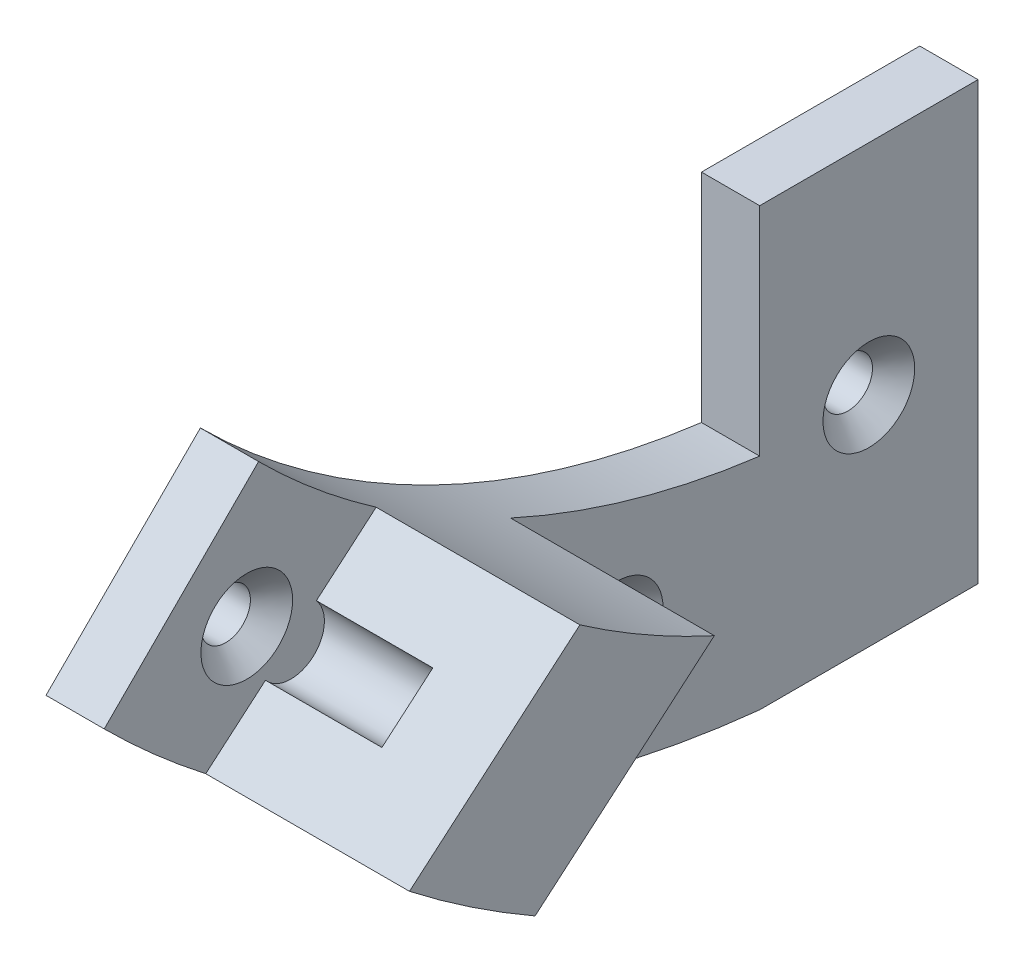
ISO-10303-21;
HEADER;
FILE_DESCRIPTION(('STEP AP214'),'2;1');
FILE_NAME('part.step','',(''),(''),'','','');
FILE_SCHEMA(('AUTOMOTIVE_DESIGN { 1 0 10303 214 1 1 1 1 }'));
ENDSEC;
DATA;
#1=APPLICATION_CONTEXT('core data for automotive mechanical design processes');
#2=APPLICATION_PROTOCOL_DEFINITION('international standard','automotive_design',2000,#1);
#3=PRODUCT_CONTEXT('',#1,'mechanical');
#4=PRODUCT('Part','Part','',(#3));
#5=PRODUCT_RELATED_PRODUCT_CATEGORY('part','',(#4));
#6=PRODUCT_DEFINITION_FORMATION('','',#4);
#7=PRODUCT_DEFINITION_CONTEXT('part definition',#1,'design');
#8=PRODUCT_DEFINITION('design','',#6,#7);
#9=PRODUCT_DEFINITION_SHAPE('','',#8);
#10=(LENGTH_UNIT() NAMED_UNIT(*) SI_UNIT(.MILLI.,.METRE.));
#11=(NAMED_UNIT(*) PLANE_ANGLE_UNIT() SI_UNIT($,.RADIAN.));
#12=(NAMED_UNIT(*) SI_UNIT($,.STERADIAN.) SOLID_ANGLE_UNIT());
#13=UNCERTAINTY_MEASURE_WITH_UNIT(LENGTH_MEASURE(1.E-05),#10,'distance_accuracy_value','');
#14=(GEOMETRIC_REPRESENTATION_CONTEXT(3) GLOBAL_UNCERTAINTY_ASSIGNED_CONTEXT((#13)) GLOBAL_UNIT_ASSIGNED_CONTEXT((#10,
#11,#12)) REPRESENTATION_CONTEXT('',''));
#15=CARTESIAN_POINT('',(0.,0.,0.));
#16=DIRECTION('',(0.,0.,1.));
#17=DIRECTION('',(1.,0.,0.));
#18=AXIS2_PLACEMENT_3D('',#15,#16,#17);
#19=CARTESIAN_POINT('',(18.,22.6357584304622,19.3395976224723));
#20=DIRECTION('',(0.,0.760292603951318,0.64958075431537));
#21=DIRECTION('',(0.,-0.64958075431537,0.760292603951318));
#22=AXIS2_PLACEMENT_3D('',#19,#20,#21);
#23=PLANE('',#22);
#24=DIRECTION('',(0.,0.64958075431537,-0.760292603951318));
#25=VECTOR('',#24,1.);
#26=CARTESIAN_POINT('',(4.,22.6357584304622,19.3395976224723));
#27=LINE('',#26,#25);
#28=CARTESIAN_POINT('',(4.,6.72656120434037,37.9602924405809));
#29=VERTEX_POINT('',#28);
#30=CARTESIAN_POINT('',(4.,10.2342841132433,33.8547277873296));
#31=VERTEX_POINT('',#30);
#32=EDGE_CURVE('E57',#29,#31,#27,.T.);
#33=ORIENTED_EDGE('',*,*,#32,.F.);
#34=DIRECTION('',(-1.,0.,0.));
#35=VECTOR('',#34,1.);
#36=CARTESIAN_POINT('',(12.,6.72656120434037,37.9602924405809));
#37=LINE('',#36,#35);
#38=CARTESIAN_POINT('',(12.,6.72656120434038,37.9602924405809));
#39=VERTEX_POINT('',#38);
#40=EDGE_CURVE('E11',#29,#39,#37,.F.);
#41=ORIENTED_EDGE('',*,*,#40,.T.);
#42=DIRECTION('',(0.,0.64958075431537,-0.760292603951318));
#43=VECTOR('',#42,1.);
#44=CARTESIAN_POINT('',(12.,22.6357584304622,19.3395976224723));
#45=LINE('',#44,#43);
#46=CARTESIAN_POINT('',(12.,3.73848973448968,41.4576384187569));
#47=VERTEX_POINT('',#46);
#48=EDGE_CURVE('E140',#47,#39,#45,.T.);
#49=ORIENTED_EDGE('',*,*,#48,.F.);
#50=DIRECTION('',(-1.,0.,0.));
#51=VECTOR('',#50,1.);
#52=CARTESIAN_POINT('',(12.,3.73848973448967,41.4576384187569));
#53=LINE('',#52,#51);
#54=CARTESIAN_POINT('',(4.,3.73848973448968,41.4576384187569));
#55=VERTEX_POINT('',#54);
#56=EDGE_CURVE('E44',#47,#55,#53,.T.);
#57=ORIENTED_EDGE('',*,*,#56,.T.);
#58=CARTESIAN_POINT('',(4.,0.230766825586766,45.5632030720082));
#59=VERTEX_POINT('',#58);
#60=EDGE_CURVE('E139',#59,#55,#27,.T.);
#61=ORIENTED_EDGE('',*,*,#60,.F.);
#62=DIRECTION('',(-1.,0.,0.));
#63=VECTOR('',#62,1.);
#64=CARTESIAN_POINT('',(18.,0.230766825586766,45.5632030720082));
#65=LINE('',#64,#63);
#66=CARTESIAN_POINT('',(18.,0.230766825586766,45.5632030720082));
#67=VERTEX_POINT('',#66);
#68=EDGE_CURVE('E155',#67,#59,#65,.T.);
#69=ORIENTED_EDGE('',*,*,#68,.F.);
#70=DIRECTION('',(0.,0.64958075431537,-0.760292603951318));
#71=VECTOR('',#70,1.);
#72=CARTESIAN_POINT('',(18.,22.6357584304622,19.3395976224723));
#73=LINE('',#72,#71);
#74=CARTESIAN_POINT('',(18.,10.2342841132433,33.8547277873296));
#75=VERTEX_POINT('',#74);
#76=EDGE_CURVE('E158',#67,#75,#73,.T.);
#77=ORIENTED_EDGE('',*,*,#76,.T.);
#78=DIRECTION('',(-1.,0.,0.));
#79=VECTOR('',#78,1.);
#80=CARTESIAN_POINT('',(18.,10.2342841132433,33.8547277873296));
#81=LINE('',#80,#79);
#82=EDGE_CURVE('E157',#75,#31,#81,.T.);
#83=ORIENTED_EDGE('',*,*,#82,.T.);
#84=EDGE_LOOP('',(#33,#41,#49,#57,#61,#69,#77,#83));
#85=FACE_BOUND('',#84,.T.);
#86=ADVANCED_FACE('F35',(#85),#23,.T.);
#87=CARTESIAN_POINT('',(4.,0.,0.));
#88=DIRECTION('',(1.,0.,0.));
#89=DIRECTION('',(0.,0.,-1.));
#90=AXIS2_PLACEMENT_3D('',#87,#88,#89);
#91=PLANE('',#90);
#92=CARTESIAN_POINT('',(4.,7.59,42.74343682));
#93=DIRECTION('',(1.,0.,0.));
#94=DIRECTION('',(0.,0.,-1.));
#95=AXIS2_PLACEMENT_3D('',#92,#93,#94);
#96=CIRCLE('',#95,3.15);
#97=CARTESIAN_POINT('',(4.,7.59,39.59343682));
#98=VERTEX_POINT('',#97);
#99=EDGE_CURVE('E515',#98,#98,#96,.T.);
#100=ORIENTED_EDGE('',*,*,#99,.F.);
#101=EDGE_LOOP('',(#100));
#102=FACE_BOUND('',#101,.T.);
#103=ORIENTED_EDGE('',*,*,#60,.T.);
#104=CARTESIAN_POINT('',(4.,5.23252546941502,39.7089654296689));
#105=DIRECTION('',(1.,0.,0.));
#106=DIRECTION('',(0.,0.,-1.));
#107=AXIS2_PLACEMENT_3D('',#104,#105,#106);
#108=CIRCLE('',#107,2.3);
#109=EDGE_CURVE('E52',#55,#29,#108,.T.);
#110=ORIENTED_EDGE('',*,*,#109,.T.);
#111=ORIENTED_EDGE('',*,*,#32,.T.);
#112=CARTESIAN_POINT('',(4.,58.9204978338215,0.));
#113=DIRECTION('',(1.,0.,0.));
#114=DIRECTION('',(0.,0.,-1.));
#115=AXIS2_PLACEMENT_3D('',#112,#113,#114);
#116=CIRCLE('',#115,59.3);
#117=CARTESIAN_POINT('',(4.,16.9890657094589,41.931432124362));
#118=VERTEX_POINT('',#117);
#119=EDGE_CURVE('E181',#31,#118,#116,.F.);
#120=ORIENTED_EDGE('',*,*,#119,.T.);
#121=DIRECTION('',(0.,0.707106781186552,-0.707106781186543));
#122=VECTOR('',#121,1.);
#123=CARTESIAN_POINT('',(4.,29.4602489169104,29.4602489169107));
#124=LINE('',#123,#122);
#125=CARTESIAN_POINT('',(4.,6.38246399166067,52.5380338421602));
#126=VERTEX_POINT('',#125);
#127=EDGE_CURVE('E184',#126,#118,#124,.T.);
#128=ORIENTED_EDGE('',*,*,#127,.F.);
#129=CARTESIAN_POINT('',(4.,58.9204978338215,0.));
#130=DIRECTION('',(1.,0.,0.));
#131=DIRECTION('',(0.,0.,-1.));
#132=AXIS2_PLACEMENT_3D('',#129,#130,#131);
#133=CIRCLE('',#132,74.3);
#134=EDGE_CURVE('E144',#59,#126,#133,.F.);
#135=ORIENTED_EDGE('',*,*,#134,.F.);
#136=EDGE_LOOP('',(#103,#110,#111,#120,#128,#135));
#137=FACE_BOUND('',#136,.T.);
#138=ADVANCED_FACE('F142',(#102,#137),#91,.T.);
#139=CARTESIAN_POINT('',(4.,58.9204978338215,0.));
#140=DIRECTION('',(-1.,0.,0.));
#141=DIRECTION('',(0.,0.,1.));
#142=AXIS2_PLACEMENT_3D('',#139,#140,#141);
#143=CYLINDRICAL_SURFACE('',#142,74.3);
#144=CARTESIAN_POINT('',(0.,58.9204978338215,0.));
#145=DIRECTION('',(1.,0.,0.));
#146=DIRECTION('',(0.,0.,-1.));
#147=AXIS2_PLACEMENT_3D('',#144,#145,#146);
#148=CIRCLE('',#147,74.3);
#149=CARTESIAN_POINT('',(0.,-15.,7.5));
#150=VERTEX_POINT('',#149);
#151=CARTESIAN_POINT('',(0.,6.38246399166067,52.5380338421602));
#152=VERTEX_POINT('',#151);
#153=EDGE_CURVE('E167',#150,#152,#148,.F.);
#154=ORIENTED_EDGE('',*,*,#153,.F.);
#155=DIRECTION('',(-1.,0.,0.));
#156=VECTOR('',#155,1.);
#157=CARTESIAN_POINT('',(4.,-15.,7.5));
#158=LINE('',#157,#156);
#159=CARTESIAN_POINT('',(4.,-15.,7.5));
#160=VERTEX_POINT('',#159);
#161=EDGE_CURVE('E219',#160,#150,#158,.T.);
#162=ORIENTED_EDGE('',*,*,#161,.F.);
#163=CARTESIAN_POINT('',(4.,-5.54941823103765,36.9339941326419));
#164=VERTEX_POINT('',#163);
#165=EDGE_CURVE('E168',#160,#164,#133,.F.);
#166=ORIENTED_EDGE('',*,*,#165,.T.);
#167=DIRECTION('',(-1.,0.,0.));
#168=VECTOR('',#167,1.);
#169=CARTESIAN_POINT('',(18.,-5.54941823103765,36.9339941326419));
#170=LINE('',#169,#168);
#171=CARTESIAN_POINT('',(18.,-5.54941823103765,36.9339941326419));
#172=VERTEX_POINT('',#171);
#173=EDGE_CURVE('E164',#172,#164,#170,.T.);
#174=ORIENTED_EDGE('',*,*,#173,.F.);
#175=CARTESIAN_POINT('',(18.,58.9204978338215,0.));
#176=DIRECTION('',(1.,0.,0.));
#177=DIRECTION('',(0.,0.,-1.));
#178=AXIS2_PLACEMENT_3D('',#175,#176,#177);
#179=CIRCLE('',#178,74.3);
#180=EDGE_CURVE('E146',#67,#172,#179,.T.);
#181=ORIENTED_EDGE('',*,*,#180,.F.);
#182=ORIENTED_EDGE('',*,*,#68,.T.);
#183=ORIENTED_EDGE('',*,*,#134,.T.);
#184=DIRECTION('',(-1.,0.,0.));
#185=VECTOR('',#184,1.);
#186=CARTESIAN_POINT('',(4.,6.38246399166067,52.5380338421602));
#187=LINE('',#186,#185);
#188=EDGE_CURVE('E187',#126,#152,#187,.T.);
#189=ORIENTED_EDGE('',*,*,#188,.T.);
#190=EDGE_LOOP('',(#154,#162,#166,#174,#181,#182,#183,#189));
#191=FACE_BOUND('',#190,.T.);
#192=ADVANCED_FACE('F37',(#191),#143,.T.);
#193=CARTESIAN_POINT('',(4.,-15.,0.));
#194=DIRECTION('',(0.,1.,0.));
#195=DIRECTION('',(0.,0.,1.));
#196=AXIS2_PLACEMENT_3D('',#193,#194,#195);
#197=PLANE('',#196);
#198=DIRECTION('',(0.,0.,-1.));
#199=VECTOR('',#198,1.);
#200=CARTESIAN_POINT('',(0.,-15.,0.));
#201=LINE('',#200,#199);
#202=CARTESIAN_POINT('',(0.,-15.,-7.5));
#203=VERTEX_POINT('',#202);
#204=EDGE_CURVE('E190',#150,#203,#201,.T.);
#205=ORIENTED_EDGE('',*,*,#204,.T.);
#206=DIRECTION('',(-1.,0.,0.));
#207=VECTOR('',#206,1.);
#208=CARTESIAN_POINT('',(4.,-15.,-7.5));
#209=LINE('',#208,#207);
#210=CARTESIAN_POINT('',(4.,-15.,-7.5));
#211=VERTEX_POINT('',#210);
#212=EDGE_CURVE('E217',#211,#203,#209,.T.);
#213=ORIENTED_EDGE('',*,*,#212,.F.);
#214=DIRECTION('',(0.,0.,-1.));
#215=VECTOR('',#214,1.);
#216=CARTESIAN_POINT('',(4.,-15.,0.));
#217=LINE('',#216,#215);
#218=EDGE_CURVE('E171',#160,#211,#217,.T.);
#219=ORIENTED_EDGE('',*,*,#218,.F.);
#220=ORIENTED_EDGE('',*,*,#161,.T.);
#221=EDGE_LOOP('',(#205,#213,#219,#220));
#222=FACE_BOUND('',#221,.T.);
#223=ADVANCED_FACE('F271',(#222),#197,.F.);
#224=CARTESIAN_POINT('',(4.,0.,-7.5));
#225=DIRECTION('',(0.,0.,-1.));
#226=DIRECTION('',(0.,1.,0.));
#227=AXIS2_PLACEMENT_3D('',#224,#225,#226);
#228=PLANE('',#227);
#229=DIRECTION('',(0.,-1.,0.));
#230=VECTOR('',#229,1.);
#231=CARTESIAN_POINT('',(0.,0.,-7.5));
#232=LINE('',#231,#230);
#233=CARTESIAN_POINT('',(0.,15.,-7.5));
#234=VERTEX_POINT('',#233);
#235=EDGE_CURVE('E193',#234,#203,#232,.T.);
#236=ORIENTED_EDGE('',*,*,#235,.F.);
#237=DIRECTION('',(-1.,0.,0.));
#238=VECTOR('',#237,1.);
#239=CARTESIAN_POINT('',(4.,15.,-7.5));
#240=LINE('',#239,#238);
#241=CARTESIAN_POINT('',(4.,15.,-7.5));
#242=VERTEX_POINT('',#241);
#243=EDGE_CURVE('E215',#242,#234,#240,.T.);
#244=ORIENTED_EDGE('',*,*,#243,.F.);
#245=DIRECTION('',(0.,-1.,0.));
#246=VECTOR('',#245,1.);
#247=CARTESIAN_POINT('',(4.,0.,-7.5));
#248=LINE('',#247,#246);
#249=EDGE_CURVE('E173',#242,#211,#248,.T.);
#250=ORIENTED_EDGE('',*,*,#249,.T.);
#251=ORIENTED_EDGE('',*,*,#212,.T.);
#252=EDGE_LOOP('',(#236,#244,#250,#251));
#253=FACE_BOUND('',#252,.T.);
#254=ADVANCED_FACE('F291',(#253),#228,.T.);
#255=CARTESIAN_POINT('',(4.,15.,0.));
#256=DIRECTION('',(0.,1.,0.));
#257=DIRECTION('',(0.,0.,1.));
#258=AXIS2_PLACEMENT_3D('',#255,#256,#257);
#259=PLANE('',#258);
#260=DIRECTION('',(0.,0.,-1.));
#261=VECTOR('',#260,1.);
#262=CARTESIAN_POINT('',(0.,15.,0.));
#263=LINE('',#262,#261);
#264=CARTESIAN_POINT('',(0.,15.,7.5));
#265=VERTEX_POINT('',#264);
#266=EDGE_CURVE('E196',#265,#234,#263,.T.);
#267=ORIENTED_EDGE('',*,*,#266,.F.);
#268=DIRECTION('',(-1.,0.,0.));
#269=VECTOR('',#268,1.);
#270=CARTESIAN_POINT('',(4.,15.,7.5));
#271=LINE('',#270,#269);
#272=CARTESIAN_POINT('',(4.,15.,7.5));
#273=VERTEX_POINT('',#272);
#274=EDGE_CURVE('E213',#273,#265,#271,.T.);
#275=ORIENTED_EDGE('',*,*,#274,.F.);
#276=DIRECTION('',(0.,0.,-1.));
#277=VECTOR('',#276,1.);
#278=CARTESIAN_POINT('',(4.,15.,0.));
#279=LINE('',#278,#277);
#280=EDGE_CURVE('E176',#273,#242,#279,.T.);
#281=ORIENTED_EDGE('',*,*,#280,.T.);
#282=ORIENTED_EDGE('',*,*,#243,.T.);
#283=EDGE_LOOP('',(#267,#275,#281,#282));
#284=FACE_BOUND('',#283,.T.);
#285=ADVANCED_FACE('F289',(#284),#259,.T.);
#286=CARTESIAN_POINT('',(4.,0.,7.5));
#287=DIRECTION('',(0.,0.,-1.));
#288=DIRECTION('',(0.,1.,0.));
#289=AXIS2_PLACEMENT_3D('',#286,#287,#288);
#290=PLANE('',#289);
#291=DIRECTION('',(0.,-1.,0.));
#292=VECTOR('',#291,1.);
#293=CARTESIAN_POINT('',(0.,0.,7.5));
#294=LINE('',#293,#292);
#295=CARTESIAN_POINT('',(0.,0.0966931285832709,7.5));
#296=VERTEX_POINT('',#295);
#297=EDGE_CURVE('E199',#265,#296,#294,.T.);
#298=ORIENTED_EDGE('',*,*,#297,.T.);
#299=DIRECTION('',(-1.,0.,0.));
#300=VECTOR('',#299,1.);
#301=CARTESIAN_POINT('',(4.,0.0966931285832709,7.5));
#302=LINE('',#301,#300);
#303=CARTESIAN_POINT('',(4.,0.0966931285832709,7.5));
#304=VERTEX_POINT('',#303);
#305=EDGE_CURVE('E210',#304,#296,#302,.T.);
#306=ORIENTED_EDGE('',*,*,#305,.F.);
#307=DIRECTION('',(0.,-1.,0.));
#308=VECTOR('',#307,1.);
#309=CARTESIAN_POINT('',(4.,0.,7.5));
#310=LINE('',#309,#308);
#311=EDGE_CURVE('E179',#273,#304,#310,.T.);
#312=ORIENTED_EDGE('',*,*,#311,.F.);
#313=ORIENTED_EDGE('',*,*,#274,.T.);
#314=EDGE_LOOP('',(#298,#306,#312,#313));
#315=FACE_BOUND('',#314,.T.);
#316=ADVANCED_FACE('F285',(#315),#290,.F.);
#317=CARTESIAN_POINT('',(4.,58.9204978338215,0.));
#318=DIRECTION('',(-1.,0.,0.));
#319=DIRECTION('',(0.,0.,1.));
#320=AXIS2_PLACEMENT_3D('',#317,#318,#319);
#321=CYLINDRICAL_SURFACE('',#320,59.3);
#322=CARTESIAN_POINT('',(0.,58.9204978338215,0.));
#323=DIRECTION('',(1.,0.,0.));
#324=DIRECTION('',(0.,0.,-1.));
#325=AXIS2_PLACEMENT_3D('',#322,#323,#324);
#326=CIRCLE('',#325,59.3);
#327=CARTESIAN_POINT('',(0.,16.9890657094589,41.931432124362));
#328=VERTEX_POINT('',#327);
#329=EDGE_CURVE('E201',#296,#328,#326,.F.);
#330=ORIENTED_EDGE('',*,*,#329,.T.);
#331=DIRECTION('',(-1.,0.,0.));
#332=VECTOR('',#331,1.);
#333=CARTESIAN_POINT('',(4.,16.9890657094589,41.931432124362));
#334=LINE('',#333,#332);
#335=EDGE_CURVE('E208',#118,#328,#334,.T.);
#336=ORIENTED_EDGE('',*,*,#335,.F.);
#337=ORIENTED_EDGE('',*,*,#119,.F.);
#338=ORIENTED_EDGE('',*,*,#82,.F.);
#339=CARTESIAN_POINT('',(18.,58.9204978338215,0.));
#340=DIRECTION('',(1.,0.,0.));
#341=DIRECTION('',(0.,0.,-1.));
#342=AXIS2_PLACEMENT_3D('',#339,#340,#341);
#343=CIRCLE('',#342,59.3);
#344=CARTESIAN_POINT('',(18.,4.97237918013021,24.6189052097621));
#345=VERTEX_POINT('',#344);
#346=EDGE_CURVE('E245',#345,#75,#343,.F.);
#347=ORIENTED_EDGE('',*,*,#346,.F.);
#348=DIRECTION('',(-1.,0.,0.));
#349=VECTOR('',#348,1.);
#350=CARTESIAN_POINT('',(18.,4.97237918013021,24.6189052097621));
#351=LINE('',#350,#349);
#352=CARTESIAN_POINT('',(4.,4.97237918013021,24.6189052097621));
#353=VERTEX_POINT('',#352);
#354=EDGE_CURVE('E161',#345,#353,#351,.T.);
#355=ORIENTED_EDGE('',*,*,#354,.T.);
#356=EDGE_CURVE('E182',#304,#353,#116,.F.);
#357=ORIENTED_EDGE('',*,*,#356,.F.);
#358=ORIENTED_EDGE('',*,*,#305,.T.);
#359=EDGE_LOOP('',(#330,#336,#337,#338,#347,#355,#357,#358));
#360=FACE_BOUND('',#359,.T.);
#361=ADVANCED_FACE('F256',(#360),#321,.F.);
#362=CARTESIAN_POINT('',(4.,29.4602489169104,29.4602489169107));
#363=DIRECTION('',(0.,0.707106781186543,0.707106781186552));
#364=DIRECTION('',(0.,-0.707106781186552,0.707106781186543));
#365=AXIS2_PLACEMENT_3D('',#362,#363,#364);
#366=PLANE('',#365);
#367=DIRECTION('',(0.,0.707106781186552,-0.707106781186543));
#368=VECTOR('',#367,1.);
#369=CARTESIAN_POINT('',(0.,29.4602489169104,29.4602489169107));
#370=LINE('',#369,#368);
#371=EDGE_CURVE('E204',#152,#328,#370,.T.);
#372=ORIENTED_EDGE('',*,*,#371,.F.);
#373=ORIENTED_EDGE('',*,*,#188,.F.);
#374=ORIENTED_EDGE('',*,*,#127,.T.);
#375=ORIENTED_EDGE('',*,*,#335,.T.);
#376=EDGE_LOOP('',(#372,#373,#374,#375));
#377=FACE_BOUND('',#376,.T.);
#378=ADVANCED_FACE('F261',(#377),#366,.T.);
#379=CARTESIAN_POINT('',(4.,0.,0.));
#380=DIRECTION('',(1.,0.,0.));
#381=DIRECTION('',(0.,0.,-1.));
#382=AXIS2_PLACEMENT_3D('',#379,#380,#381);
#383=CIRCLE('',#382,3.15);
#384=CARTESIAN_POINT('',(4.,0.,-3.15));
#385=VERTEX_POINT('',#384);
#386=EDGE_CURVE('E233',#385,#385,#383,.T.);
#387=ORIENTED_EDGE('',*,*,#386,.F.);
#388=EDGE_LOOP('',(#387));
#389=FACE_BOUND('',#388,.T.);
#390=CARTESIAN_POINT('',(4.,-5.60334736228844,17.289112212848));
#391=DIRECTION('',(1.,0.,0.));
#392=DIRECTION('',(0.,0.,-1.));
#393=AXIS2_PLACEMENT_3D('',#390,#391,#392);
#394=CIRCLE('',#393,3.15);
#395=CARTESIAN_POINT('',(4.,-5.60334736228844,14.139112212848));
#396=VERTEX_POINT('',#395);
#397=EDGE_CURVE('E226',#396,#396,#394,.T.);
#398=ORIENTED_EDGE('',*,*,#397,.F.);
#399=EDGE_LOOP('',(#398));
#400=FACE_BOUND('',#399,.T.);
#401=DIRECTION('',(0.,0.649580754315369,-0.760292603951319));
#402=VECTOR('',#401,1.);
#403=CARTESIAN_POINT('',(4.,15.0328323909491,12.8437900793185));
#404=LINE('',#403,#402);
#405=EDGE_CURVE('E151',#164,#353,#404,.T.);
#406=ORIENTED_EDGE('',*,*,#405,.F.);
#407=ORIENTED_EDGE('',*,*,#165,.F.);
#408=ORIENTED_EDGE('',*,*,#218,.T.);
#409=ORIENTED_EDGE('',*,*,#249,.F.);
#410=ORIENTED_EDGE('',*,*,#280,.F.);
#411=ORIENTED_EDGE('',*,*,#311,.T.);
#412=ORIENTED_EDGE('',*,*,#356,.T.);
#413=EDGE_LOOP('',(#406,#407,#408,#409,#410,#411,#412));
#414=FACE_BOUND('',#413,.T.);
#415=ADVANCED_FACE('F280',(#389,#400,#414),#91,.T.);
#416=CARTESIAN_POINT('',(0.,0.,0.));
#417=DIRECTION('',(1.,0.,0.));
#418=DIRECTION('',(0.,0.,-1.));
#419=AXIS2_PLACEMENT_3D('',#416,#417,#418);
#420=PLANE('',#419);
#421=CARTESIAN_POINT('',(0.,7.59,42.74343682));
#422=DIRECTION('',(1.,0.,0.));
#423=DIRECTION('',(0.,0.,-1.));
#424=AXIS2_PLACEMENT_3D('',#421,#422,#423);
#425=CIRCLE('',#424,1.7);
#426=CARTESIAN_POINT('',(0.,7.59,41.04343682));
#427=VERTEX_POINT('',#426);
#428=EDGE_CURVE('E39',#427,#427,#425,.T.);
#429=ORIENTED_EDGE('',*,*,#428,.T.);
#430=EDGE_LOOP('',(#429));
#431=FACE_BOUND('',#430,.T.);
#432=CARTESIAN_POINT('',(0.,0.,0.));
#433=DIRECTION('',(1.,0.,0.));
#434=DIRECTION('',(0.,0.,-1.));
#435=AXIS2_PLACEMENT_3D('',#432,#433,#434);
#436=CIRCLE('',#435,1.7);
#437=CARTESIAN_POINT('',(0.,0.,-1.7));
#438=VERTEX_POINT('',#437);
#439=EDGE_CURVE('E224',#438,#438,#436,.T.);
#440=ORIENTED_EDGE('',*,*,#439,.T.);
#441=EDGE_LOOP('',(#440));
#442=FACE_BOUND('',#441,.T.);
#443=CARTESIAN_POINT('',(0.,-5.60334736228844,17.289112212848));
#444=DIRECTION('',(1.,0.,0.));
#445=DIRECTION('',(0.,0.,-1.));
#446=AXIS2_PLACEMENT_3D('',#443,#444,#445);
#447=CIRCLE('',#446,1.7);
#448=CARTESIAN_POINT('',(0.,-5.60334736228844,15.589112212848));
#449=VERTEX_POINT('',#448);
#450=EDGE_CURVE('E134',#449,#449,#447,.T.);
#451=ORIENTED_EDGE('',*,*,#450,.T.);
#452=EDGE_LOOP('',(#451));
#453=FACE_BOUND('',#452,.T.);
#454=ORIENTED_EDGE('',*,*,#153,.T.);
#455=ORIENTED_EDGE('',*,*,#371,.T.);
#456=ORIENTED_EDGE('',*,*,#329,.F.);
#457=ORIENTED_EDGE('',*,*,#297,.F.);
#458=ORIENTED_EDGE('',*,*,#266,.T.);
#459=ORIENTED_EDGE('',*,*,#235,.T.);
#460=ORIENTED_EDGE('',*,*,#204,.F.);
#461=EDGE_LOOP('',(#454,#455,#456,#457,#458,#459,#460));
#462=FACE_BOUND('',#461,.T.);
#463=ADVANCED_FACE('F266',(#431,#442,#453,#462),#420,.F.);
#464=CARTESIAN_POINT('',(18.,15.0328323909491,12.8437900793185));
#465=DIRECTION('',(0.,0.760292603951318,0.649580754315369));
#466=DIRECTION('',(0.,-0.649580754315369,0.760292603951318));
#467=AXIS2_PLACEMENT_3D('',#464,#465,#466);
#468=PLANE('',#467);
#469=ORIENTED_EDGE('',*,*,#405,.T.);
#470=ORIENTED_EDGE('',*,*,#354,.F.);
#471=DIRECTION('',(0.,0.649580754315369,-0.760292603951319));
#472=VECTOR('',#471,1.);
#473=CARTESIAN_POINT('',(18.,15.0328323909491,12.8437900793185));
#474=LINE('',#473,#472);
#475=EDGE_CURVE('E149',#172,#345,#474,.T.);
#476=ORIENTED_EDGE('',*,*,#475,.F.);
#477=ORIENTED_EDGE('',*,*,#173,.T.);
#478=EDGE_LOOP('',(#469,#470,#476,#477));
#479=FACE_BOUND('',#478,.T.);
#480=ADVANCED_FACE('F277',(#479),#468,.F.);
#481=CARTESIAN_POINT('',(18.,0.,0.));
#482=DIRECTION('',(1.,0.,0.));
#483=DIRECTION('',(0.,0.,-1.));
#484=AXIS2_PLACEMENT_3D('',#481,#482,#483);
#485=PLANE('',#484);
#486=ORIENTED_EDGE('',*,*,#180,.T.);
#487=ORIENTED_EDGE('',*,*,#475,.T.);
#488=ORIENTED_EDGE('',*,*,#346,.T.);
#489=ORIENTED_EDGE('',*,*,#76,.F.);
#490=EDGE_LOOP('',(#486,#487,#488,#489));
#491=FACE_BOUND('',#490,.T.);
#492=ADVANCED_FACE('F251',(#491),#485,.T.);
#493=CARTESIAN_POINT('',(12.,5.23252546941502,39.7089654296689));
#494=DIRECTION('',(-1.,0.,0.));
#495=DIRECTION('',(0.,0.,1.));
#496=AXIS2_PLACEMENT_3D('',#493,#494,#495);
#497=CYLINDRICAL_SURFACE('',#496,2.3);
#498=ORIENTED_EDGE('',*,*,#109,.F.);
#499=ORIENTED_EDGE('',*,*,#56,.F.);
#500=CARTESIAN_POINT('',(12.,5.23252546941502,39.7089654296689));
#501=DIRECTION('',(1.,0.,0.));
#502=DIRECTION('',(0.,0.,-1.));
#503=AXIS2_PLACEMENT_3D('',#500,#501,#502);
#504=CIRCLE('',#503,2.3);
#505=EDGE_CURVE('E133',#47,#39,#504,.T.);
#506=ORIENTED_EDGE('',*,*,#505,.T.);
#507=ORIENTED_EDGE('',*,*,#40,.F.);
#508=EDGE_LOOP('',(#498,#499,#506,#507));
#509=FACE_BOUND('',#508,.T.);
#510=ADVANCED_FACE('F130',(#509),#497,.F.);
#511=CARTESIAN_POINT('',(12.,5.23252546941502,39.7089654296689));
#512=DIRECTION('',(1.,0.,0.));
#513=DIRECTION('',(0.,0.,-1.));
#514=AXIS2_PLACEMENT_3D('',#511,#512,#513);
#515=PLANE('',#514);
#516=ORIENTED_EDGE('',*,*,#48,.T.);
#517=ORIENTED_EDGE('',*,*,#505,.F.);
#518=EDGE_LOOP('',(#516,#517));
#519=FACE_BOUND('',#518,.T.);
#520=ADVANCED_FACE('F359',(#519),#515,.F.);
#521=CARTESIAN_POINT('',(4.,-5.60334736228844,17.289112212848));
#522=DIRECTION('',(1.,0.,0.));
#523=DIRECTION('',(0.,0.,-1.));
#524=AXIS2_PLACEMENT_3D('',#521,#522,#523);
#525=CYLINDRICAL_SURFACE('',#524,1.7);
#526=CARTESIAN_POINT('',(2.55,-5.60334736228844,17.289112212848));
#527=DIRECTION('',(1.,0.,0.));
#528=DIRECTION('',(0.,0.,-1.));
#529=AXIS2_PLACEMENT_3D('',#526,#527,#528);
#530=CIRCLE('',#529,1.7);
#531=CARTESIAN_POINT('',(2.55,-5.60334736228844,15.589112212848));
#532=VERTEX_POINT('',#531);
#533=EDGE_CURVE('E223',#532,#532,#530,.T.);
#534=ORIENTED_EDGE('',*,*,#533,.T.);
#535=EDGE_LOOP('',(#534));
#536=FACE_BOUND('',#535,.T.);
#537=ORIENTED_EDGE('',*,*,#450,.F.);
#538=EDGE_LOOP('',(#537));
#539=FACE_BOUND('',#538,.T.);
#540=ADVANCED_FACE('F365',(#536,#539),#525,.F.);
#541=CARTESIAN_POINT('',(4.,-5.60334736228844,17.289112212848));
#542=DIRECTION('',(1.,0.,0.));
#543=DIRECTION('',(0.,0.,-1.));
#544=AXIS2_PLACEMENT_3D('',#541,#542,#543);
#545=CONICAL_SURFACE('',#544,3.15,0.785398163397449);
#546=ORIENTED_EDGE('',*,*,#533,.F.);
#547=EDGE_LOOP('',(#546));
#548=FACE_BOUND('',#547,.T.);
#549=ORIENTED_EDGE('',*,*,#397,.T.);
#550=EDGE_LOOP('',(#549));
#551=FACE_BOUND('',#550,.T.);
#552=ADVANCED_FACE('F372',(#548,#551),#545,.F.);
#553=CARTESIAN_POINT('',(4.,0.,0.));
#554=DIRECTION('',(1.,0.,0.));
#555=DIRECTION('',(0.,0.,-1.));
#556=AXIS2_PLACEMENT_3D('',#553,#554,#555);
#557=CYLINDRICAL_SURFACE('',#556,1.7);
#558=CARTESIAN_POINT('',(2.55,0.,0.));
#559=DIRECTION('',(1.,0.,0.));
#560=DIRECTION('',(0.,0.,-1.));
#561=AXIS2_PLACEMENT_3D('',#558,#559,#560);
#562=CIRCLE('',#561,1.7);
#563=CARTESIAN_POINT('',(2.55,0.,-1.7));
#564=VERTEX_POINT('',#563);
#565=EDGE_CURVE('E227',#564,#564,#562,.T.);
#566=ORIENTED_EDGE('',*,*,#565,.T.);
#567=EDGE_LOOP('',(#566));
#568=FACE_BOUND('',#567,.T.);
#569=ORIENTED_EDGE('',*,*,#439,.F.);
#570=EDGE_LOOP('',(#569));
#571=FACE_BOUND('',#570,.T.);
#572=ADVANCED_FACE('F380',(#568,#571),#557,.F.);
#573=CARTESIAN_POINT('',(4.,0.,0.));
#574=DIRECTION('',(1.,0.,0.));
#575=DIRECTION('',(0.,0.,-1.));
#576=AXIS2_PLACEMENT_3D('',#573,#574,#575);
#577=CONICAL_SURFACE('',#576,3.15,0.785398163397449);
#578=ORIENTED_EDGE('',*,*,#565,.F.);
#579=EDGE_LOOP('',(#578));
#580=FACE_BOUND('',#579,.T.);
#581=ORIENTED_EDGE('',*,*,#386,.T.);
#582=EDGE_LOOP('',(#581));
#583=FACE_BOUND('',#582,.T.);
#584=ADVANCED_FACE('F388',(#580,#583),#577,.F.);
#585=CARTESIAN_POINT('',(4.,7.59,42.74343682));
#586=DIRECTION('',(1.,0.,0.));
#587=DIRECTION('',(0.,0.,-1.));
#588=AXIS2_PLACEMENT_3D('',#585,#586,#587);
#589=CYLINDRICAL_SURFACE('',#588,1.7);
#590=CARTESIAN_POINT('',(2.55,7.59,42.74343682));
#591=DIRECTION('',(1.,0.,0.));
#592=DIRECTION('',(0.,0.,-1.));
#593=AXIS2_PLACEMENT_3D('',#590,#591,#592);
#594=CIRCLE('',#593,1.7);
#595=CARTESIAN_POINT('',(2.55,7.59,41.04343682));
#596=VERTEX_POINT('',#595);
#597=EDGE_CURVE('E512',#596,#596,#594,.T.);
#598=ORIENTED_EDGE('',*,*,#597,.T.);
#599=EDGE_LOOP('',(#598));
#600=FACE_BOUND('',#599,.T.);
#601=ORIENTED_EDGE('',*,*,#428,.F.);
#602=EDGE_LOOP('',(#601));
#603=FACE_BOUND('',#602,.T.);
#604=ADVANCED_FACE('F395',(#600,#603),#589,.F.);
#605=CARTESIAN_POINT('',(4.,7.59,42.74343682));
#606=DIRECTION('',(1.,0.,0.));
#607=DIRECTION('',(0.,0.,-1.));
#608=AXIS2_PLACEMENT_3D('',#605,#606,#607);
#609=CONICAL_SURFACE('',#608,3.15,0.785398163397449);
#610=ORIENTED_EDGE('',*,*,#597,.F.);
#611=EDGE_LOOP('',(#610));
#612=FACE_BOUND('',#611,.T.);
#613=ORIENTED_EDGE('',*,*,#99,.T.);
#614=EDGE_LOOP('',(#613));
#615=FACE_BOUND('',#614,.T.);
#616=ADVANCED_FACE('F403',(#612,#615),#609,.F.);
#617=CLOSED_SHELL('',(#86,#138,#192,#223,#254,#285,#316,#361,#378,#415,#463,#480,#492,#510,#520,
#540,#552,#572,#584,#604,#616));
#618=MANIFOLD_SOLID_BREP('B2',#617);
#619=ADVANCED_BREP_SHAPE_REPRESENTATION('',(#18,#618),#14);
#620=SHAPE_DEFINITION_REPRESENTATION(#9,#619);
ENDSEC;
END-ISO-10303-21;
